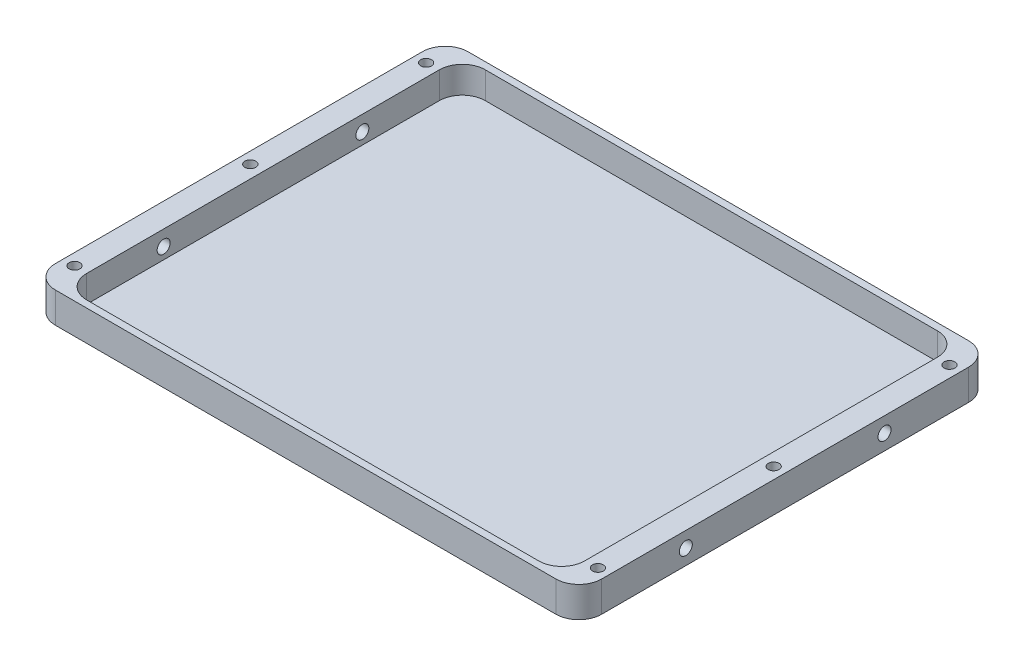
ISO-10303-21;
HEADER;
FILE_DESCRIPTION(('STEP AP214'),'2;1');
FILE_NAME('part.step','',(''),(''),'','','');
FILE_SCHEMA(('AUTOMOTIVE_DESIGN { 1 0 10303 214 1 1 1 1 }'));
ENDSEC;
DATA;
#1=APPLICATION_CONTEXT('core data for automotive mechanical design processes');
#2=APPLICATION_PROTOCOL_DEFINITION('international standard','automotive_design',2000,#1);
#3=PRODUCT_CONTEXT('',#1,'mechanical');
#4=PRODUCT('Part','Part','',(#3));
#5=PRODUCT_RELATED_PRODUCT_CATEGORY('part','',(#4));
#6=PRODUCT_DEFINITION_FORMATION('','',#4);
#7=PRODUCT_DEFINITION_CONTEXT('part definition',#1,'design');
#8=PRODUCT_DEFINITION('design','',#6,#7);
#9=PRODUCT_DEFINITION_SHAPE('','',#8);
#10=(LENGTH_UNIT() NAMED_UNIT(*) SI_UNIT(.MILLI.,.METRE.));
#11=(NAMED_UNIT(*) PLANE_ANGLE_UNIT() SI_UNIT($,.RADIAN.));
#12=(NAMED_UNIT(*) SI_UNIT($,.STERADIAN.) SOLID_ANGLE_UNIT());
#13=UNCERTAINTY_MEASURE_WITH_UNIT(LENGTH_MEASURE(1.E-05),#10,'distance_accuracy_value','');
#14=(GEOMETRIC_REPRESENTATION_CONTEXT(3) GLOBAL_UNCERTAINTY_ASSIGNED_CONTEXT((#13)) GLOBAL_UNIT_ASSIGNED_CONTEXT((#10,
#11,#12)) REPRESENTATION_CONTEXT('',''));
#15=CARTESIAN_POINT('',(0.,0.,0.));
#16=DIRECTION('',(0.,0.,1.));
#17=DIRECTION('',(1.,0.,0.));
#18=AXIS2_PLACEMENT_3D('',#15,#16,#17);
#19=CARTESIAN_POINT('',(0.,12.7,0.));
#20=DIRECTION('',(1.,0.,0.));
#21=DIRECTION('',(0.,0.,-1.));
#22=AXIS2_PLACEMENT_3D('',#19,#20,#21);
#23=PLANE('',#22);
#24=CARTESIAN_POINT('',(0.,6.35,-127.));
#25=DIRECTION('',(-1.,0.,0.));
#26=DIRECTION('',(0.,0.,1.));
#27=AXIS2_PLACEMENT_3D('',#24,#25,#26);
#28=CIRCLE('',#27,2.70509999999999);
#29=CARTESIAN_POINT('',(0.,6.35,-124.2949));
#30=VERTEX_POINT('',#29);
#31=EDGE_CURVE('E501',#30,#30,#28,.T.);
#32=ORIENTED_EDGE('',*,*,#31,.F.);
#33=EDGE_LOOP('',(#32));
#34=FACE_BOUND('',#33,.T.);
#35=CARTESIAN_POINT('',(0.,6.35,-44.45));
#36=DIRECTION('',(-1.,0.,0.));
#37=DIRECTION('',(0.,0.,1.));
#38=AXIS2_PLACEMENT_3D('',#35,#36,#37);
#39=CIRCLE('',#38,2.70509999999999);
#40=CARTESIAN_POINT('',(0.,6.35,-41.7449));
#41=VERTEX_POINT('',#40);
#42=EDGE_CURVE('E506',#41,#41,#39,.T.);
#43=ORIENTED_EDGE('',*,*,#42,.F.);
#44=EDGE_LOOP('',(#43));
#45=FACE_BOUND('',#44,.T.);
#46=DIRECTION('',(0.,0.,1.));
#47=VECTOR('',#46,1.);
#48=CARTESIAN_POINT('',(0.,12.7,0.));
#49=LINE('',#48,#47);
#50=CARTESIAN_POINT('',(0.,12.7,-161.925));
#51=VERTEX_POINT('',#50);
#52=CARTESIAN_POINT('',(0.,12.7,-9.525));
#53=VERTEX_POINT('',#52);
#54=EDGE_CURVE('E226',#51,#53,#49,.T.);
#55=ORIENTED_EDGE('',*,*,#54,.F.);
#56=DIRECTION('',(0.,-1.,0.));
#57=VECTOR('',#56,1.);
#58=CARTESIAN_POINT('',(0.,12.7,-161.925));
#59=LINE('',#58,#57);
#60=CARTESIAN_POINT('',(0.,0.,-161.925));
#61=VERTEX_POINT('',#60);
#62=EDGE_CURVE('E248',#51,#61,#59,.T.);
#63=ORIENTED_EDGE('',*,*,#62,.T.);
#64=DIRECTION('',(0.,0.,1.));
#65=VECTOR('',#64,1.);
#66=CARTESIAN_POINT('',(0.,0.,0.));
#67=LINE('',#66,#65);
#68=CARTESIAN_POINT('',(0.,0.,-9.525));
#69=VERTEX_POINT('',#68);
#70=EDGE_CURVE('E214',#61,#69,#67,.T.);
#71=ORIENTED_EDGE('',*,*,#70,.T.);
#72=DIRECTION('',(0.,-1.,0.));
#73=VECTOR('',#72,1.);
#74=CARTESIAN_POINT('',(0.,12.7,-9.525));
#75=LINE('',#74,#73);
#76=EDGE_CURVE('E237',#69,#53,#75,.F.);
#77=ORIENTED_EDGE('',*,*,#76,.T.);
#78=EDGE_LOOP('',(#55,#63,#71,#77));
#79=FACE_BOUND('',#78,.T.);
#80=ADVANCED_FACE('F34',(#34,#45,#79),#23,.F.);
#81=CARTESIAN_POINT('',(0.,12.7,0.));
#82=DIRECTION('',(0.,0.,-1.));
#83=DIRECTION('',(-1.,0.,0.));
#84=AXIS2_PLACEMENT_3D('',#81,#82,#83);
#85=PLANE('',#84);
#86=DIRECTION('',(1.,0.,0.));
#87=VECTOR('',#86,1.);
#88=CARTESIAN_POINT('',(0.,12.7,0.));
#89=LINE('',#88,#87);
#90=CARTESIAN_POINT('',(9.525,12.7,0.));
#91=VERTEX_POINT('',#90);
#92=CARTESIAN_POINT('',(217.424,12.7,0.));
#93=VERTEX_POINT('',#92);
#94=EDGE_CURVE('E229',#91,#93,#89,.T.);
#95=ORIENTED_EDGE('',*,*,#94,.F.);
#96=DIRECTION('',(0.,-1.,0.));
#97=VECTOR('',#96,1.);
#98=CARTESIAN_POINT('',(9.525,12.7,0.));
#99=LINE('',#98,#97);
#100=CARTESIAN_POINT('',(9.525,0.,0.));
#101=VERTEX_POINT('',#100);
#102=EDGE_CURVE('E273',#91,#101,#99,.T.);
#103=ORIENTED_EDGE('',*,*,#102,.T.);
#104=DIRECTION('',(1.,0.,0.));
#105=VECTOR('',#104,1.);
#106=CARTESIAN_POINT('',(0.,0.,0.));
#107=LINE('',#106,#105);
#108=CARTESIAN_POINT('',(217.424,0.,0.));
#109=VERTEX_POINT('',#108);
#110=EDGE_CURVE('E240',#101,#109,#107,.T.);
#111=ORIENTED_EDGE('',*,*,#110,.T.);
#112=DIRECTION('',(0.,-1.,0.));
#113=VECTOR('',#112,1.);
#114=CARTESIAN_POINT('',(217.424,12.7,0.));
#115=LINE('',#114,#113);
#116=EDGE_CURVE('E271',#109,#93,#115,.F.);
#117=ORIENTED_EDGE('',*,*,#116,.T.);
#118=EDGE_LOOP('',(#95,#103,#111,#117));
#119=FACE_BOUND('',#118,.T.);
#120=ADVANCED_FACE('F279',(#119),#85,.F.);
#121=CARTESIAN_POINT('',(226.949,12.7,0.));
#122=DIRECTION('',(-1.,0.,0.));
#123=DIRECTION('',(0.,0.,1.));
#124=AXIS2_PLACEMENT_3D('',#121,#122,#123);
#125=PLANE('',#124);
#126=CARTESIAN_POINT('',(226.949,6.35,-127.));
#127=DIRECTION('',(1.,0.,0.));
#128=DIRECTION('',(0.,0.,-1.));
#129=AXIS2_PLACEMENT_3D('',#126,#127,#128);
#130=CIRCLE('',#129,2.70509999999999);
#131=CARTESIAN_POINT('',(226.949,6.35,-129.7051));
#132=VERTEX_POINT('',#131);
#133=EDGE_CURVE('E462',#132,#132,#130,.T.);
#134=ORIENTED_EDGE('',*,*,#133,.F.);
#135=EDGE_LOOP('',(#134));
#136=FACE_BOUND('',#135,.T.);
#137=CARTESIAN_POINT('',(226.949,6.35,-44.45));
#138=DIRECTION('',(1.,0.,0.));
#139=DIRECTION('',(0.,0.,-1.));
#140=AXIS2_PLACEMENT_3D('',#137,#138,#139);
#141=CIRCLE('',#140,2.70509999999999);
#142=CARTESIAN_POINT('',(226.949,6.35,-47.1551));
#143=VERTEX_POINT('',#142);
#144=EDGE_CURVE('E468',#143,#143,#141,.T.);
#145=ORIENTED_EDGE('',*,*,#144,.F.);
#146=EDGE_LOOP('',(#145));
#147=FACE_BOUND('',#146,.T.);
#148=DIRECTION('',(0.,0.,-1.));
#149=VECTOR('',#148,1.);
#150=CARTESIAN_POINT('',(226.949,12.7,0.));
#151=LINE('',#150,#149);
#152=CARTESIAN_POINT('',(226.949,12.7,-9.525));
#153=VERTEX_POINT('',#152);
#154=CARTESIAN_POINT('',(226.949,12.7,-161.925));
#155=VERTEX_POINT('',#154);
#156=EDGE_CURVE('E232',#153,#155,#151,.T.);
#157=ORIENTED_EDGE('',*,*,#156,.F.);
#158=DIRECTION('',(0.,-1.,0.));
#159=VECTOR('',#158,1.);
#160=CARTESIAN_POINT('',(226.949,12.7,-9.525));
#161=LINE('',#160,#159);
#162=CARTESIAN_POINT('',(226.949,0.,-9.525));
#163=VERTEX_POINT('',#162);
#164=EDGE_CURVE('E11',#153,#163,#161,.T.);
#165=ORIENTED_EDGE('',*,*,#164,.T.);
#166=DIRECTION('',(0.,0.,-1.));
#167=VECTOR('',#166,1.);
#168=CARTESIAN_POINT('',(226.949,0.,0.));
#169=LINE('',#168,#167);
#170=CARTESIAN_POINT('',(226.949,0.,-161.925));
#171=VERTEX_POINT('',#170);
#172=EDGE_CURVE('E243',#163,#171,#169,.T.);
#173=ORIENTED_EDGE('',*,*,#172,.T.);
#174=DIRECTION('',(0.,-1.,0.));
#175=VECTOR('',#174,1.);
#176=CARTESIAN_POINT('',(226.949,12.7,-161.925));
#177=LINE('',#176,#175);
#178=EDGE_CURVE('E42',#171,#155,#177,.F.);
#179=ORIENTED_EDGE('',*,*,#178,.T.);
#180=EDGE_LOOP('',(#157,#165,#173,#179));
#181=FACE_BOUND('',#180,.T.);
#182=ADVANCED_FACE('F290',(#136,#147,#181),#125,.F.);
#183=CARTESIAN_POINT('',(0.,12.7,-171.45));
#184=DIRECTION('',(0.,0.,1.));
#185=DIRECTION('',(1.,0.,0.));
#186=AXIS2_PLACEMENT_3D('',#183,#184,#185);
#187=PLANE('',#186);
#188=DIRECTION('',(-1.,0.,0.));
#189=VECTOR('',#188,1.);
#190=CARTESIAN_POINT('',(0.,0.,-171.45));
#191=LINE('',#190,#189);
#192=CARTESIAN_POINT('',(217.424,0.,-171.45));
#193=VERTEX_POINT('',#192);
#194=CARTESIAN_POINT('',(9.525,0.,-171.45));
#195=VERTEX_POINT('',#194);
#196=EDGE_CURVE('E230',#193,#195,#191,.T.);
#197=ORIENTED_EDGE('',*,*,#196,.T.);
#198=DIRECTION('',(0.,-1.,0.));
#199=VECTOR('',#198,1.);
#200=CARTESIAN_POINT('',(9.525,12.7,-171.45));
#201=LINE('',#200,#199);
#202=CARTESIAN_POINT('',(9.525,12.7,-171.45));
#203=VERTEX_POINT('',#202);
#204=EDGE_CURVE('E262',#195,#203,#201,.F.);
#205=ORIENTED_EDGE('',*,*,#204,.T.);
#206=DIRECTION('',(-1.,0.,0.));
#207=VECTOR('',#206,1.);
#208=CARTESIAN_POINT('',(0.,12.7,-171.45));
#209=LINE('',#208,#207);
#210=CARTESIAN_POINT('',(217.424,12.7,-171.45));
#211=VERTEX_POINT('',#210);
#212=EDGE_CURVE('E234',#211,#203,#209,.T.);
#213=ORIENTED_EDGE('',*,*,#212,.F.);
#214=DIRECTION('',(0.,-1.,0.));
#215=VECTOR('',#214,1.);
#216=CARTESIAN_POINT('',(217.424,12.7,-171.45));
#217=LINE('',#216,#215);
#218=EDGE_CURVE('E259',#211,#193,#217,.T.);
#219=ORIENTED_EDGE('',*,*,#218,.T.);
#220=EDGE_LOOP('',(#197,#205,#213,#219));
#221=FACE_BOUND('',#220,.T.);
#222=ADVANCED_FACE('F298',(#221),#187,.F.);
#223=CARTESIAN_POINT('',(0.,12.7,-171.45));
#224=DIRECTION('',(0.,-1.,0.));
#225=DIRECTION('',(0.,0.,-1.));
#226=AXIS2_PLACEMENT_3D('',#223,#224,#225);
#227=PLANE('',#226);
#228=CARTESIAN_POINT('',(222.1865,12.7,-12.7));
#229=DIRECTION('',(0.,-1.,0.));
#230=DIRECTION('',(0.,0.,-1.));
#231=AXIS2_PLACEMENT_3D('',#228,#229,#230);
#232=CIRCLE('',#231,2.2479);
#233=CARTESIAN_POINT('',(222.1865,12.7,-14.9479));
#234=VERTEX_POINT('',#233);
#235=EDGE_CURVE('E439',#234,#234,#232,.T.);
#236=ORIENTED_EDGE('',*,*,#235,.T.);
#237=EDGE_LOOP('',(#236));
#238=FACE_BOUND('',#237,.T.);
#239=CARTESIAN_POINT('',(222.1865,12.7,-85.725));
#240=DIRECTION('',(0.,-1.,0.));
#241=DIRECTION('',(0.,0.,-1.));
#242=AXIS2_PLACEMENT_3D('',#239,#240,#241);
#243=CIRCLE('',#242,2.2479);
#244=CARTESIAN_POINT('',(222.1865,12.7,-87.9729));
#245=VERTEX_POINT('',#244);
#246=EDGE_CURVE('E450',#245,#245,#243,.T.);
#247=ORIENTED_EDGE('',*,*,#246,.T.);
#248=EDGE_LOOP('',(#247));
#249=FACE_BOUND('',#248,.T.);
#250=CARTESIAN_POINT('',(222.1865,12.7,-158.75));
#251=DIRECTION('',(0.,-1.,0.));
#252=DIRECTION('',(0.,0.,-1.));
#253=AXIS2_PLACEMENT_3D('',#250,#251,#252);
#254=CIRCLE('',#253,2.2479);
#255=CARTESIAN_POINT('',(222.1865,12.7,-160.9979));
#256=VERTEX_POINT('',#255);
#257=EDGE_CURVE('E459',#256,#256,#254,.T.);
#258=ORIENTED_EDGE('',*,*,#257,.T.);
#259=EDGE_LOOP('',(#258));
#260=FACE_BOUND('',#259,.T.);
#261=CARTESIAN_POINT('',(4.7625,12.7,-12.7));
#262=DIRECTION('',(0.,-1.,0.));
#263=DIRECTION('',(0.,0.,-1.));
#264=AXIS2_PLACEMENT_3D('',#261,#262,#263);
#265=CIRCLE('',#264,2.2479);
#266=CARTESIAN_POINT('',(4.7625,12.7,-14.9479));
#267=VERTEX_POINT('',#266);
#268=EDGE_CURVE('E480',#267,#267,#265,.T.);
#269=ORIENTED_EDGE('',*,*,#268,.T.);
#270=EDGE_LOOP('',(#269));
#271=FACE_BOUND('',#270,.T.);
#272=CARTESIAN_POINT('',(4.76250000000002,12.7,-85.725));
#273=DIRECTION('',(0.,-1.,0.));
#274=DIRECTION('',(0.,0.,-1.));
#275=AXIS2_PLACEMENT_3D('',#272,#273,#274);
#276=CIRCLE('',#275,2.2479);
#277=CARTESIAN_POINT('',(4.76250000000002,12.7,-87.9729));
#278=VERTEX_POINT('',#277);
#279=EDGE_CURVE('E489',#278,#278,#276,.T.);
#280=ORIENTED_EDGE('',*,*,#279,.T.);
#281=EDGE_LOOP('',(#280));
#282=FACE_BOUND('',#281,.T.);
#283=CARTESIAN_POINT('',(4.76250000000003,12.7,-158.75));
#284=DIRECTION('',(0.,-1.,0.));
#285=DIRECTION('',(0.,0.,-1.));
#286=AXIS2_PLACEMENT_3D('',#283,#284,#285);
#287=CIRCLE('',#286,2.2479);
#288=CARTESIAN_POINT('',(4.76250000000003,12.7,-160.9979));
#289=VERTEX_POINT('',#288);
#290=EDGE_CURVE('E498',#289,#289,#287,.T.);
#291=ORIENTED_EDGE('',*,*,#290,.T.);
#292=EDGE_LOOP('',(#291));
#293=FACE_BOUND('',#292,.T.);
#294=DIRECTION('',(-1.,0.,0.));
#295=VECTOR('',#294,1.);
#296=CARTESIAN_POINT('',(19.558,12.7,-168.529));
#297=LINE('',#296,#295);
#298=CARTESIAN_POINT('',(207.391,12.7,-168.529));
#299=VERTEX_POINT('',#298);
#300=CARTESIAN_POINT('',(19.558,12.7,-168.529));
#301=VERTEX_POINT('',#300);
#302=EDGE_CURVE('E196',#299,#301,#297,.T.);
#303=ORIENTED_EDGE('',*,*,#302,.F.);
#304=CARTESIAN_POINT('',(207.391,12.7,-159.004));
#305=DIRECTION('',(0.,1.,0.));
#306=DIRECTION('',(0.,0.,-1.));
#307=AXIS2_PLACEMENT_3D('',#304,#305,#306);
#308=CIRCLE('',#307,9.52500000000001);
#309=CARTESIAN_POINT('',(216.916,12.7,-159.004));
#310=VERTEX_POINT('',#309);
#311=EDGE_CURVE('E155',#310,#299,#308,.T.);
#312=ORIENTED_EDGE('',*,*,#311,.F.);
#313=DIRECTION('',(0.,0.,-1.));
#314=VECTOR('',#313,1.);
#315=CARTESIAN_POINT('',(216.916,12.7,-12.446));
#316=LINE('',#315,#314);
#317=CARTESIAN_POINT('',(216.916,12.7,-12.446));
#318=VERTEX_POINT('',#317);
#319=EDGE_CURVE('E173',#318,#310,#316,.T.);
#320=ORIENTED_EDGE('',*,*,#319,.F.);
#321=CARTESIAN_POINT('',(207.391,12.7,-12.446));
#322=DIRECTION('',(0.,1.,0.));
#323=DIRECTION('',(0.,0.,1.));
#324=AXIS2_PLACEMENT_3D('',#321,#322,#323);
#325=CIRCLE('',#324,9.525);
#326=CARTESIAN_POINT('',(207.391,12.7,-2.92100000000001));
#327=VERTEX_POINT('',#326);
#328=EDGE_CURVE('E176',#327,#318,#325,.T.);
#329=ORIENTED_EDGE('',*,*,#328,.F.);
#330=DIRECTION('',(1.,0.,0.));
#331=VECTOR('',#330,1.);
#332=CARTESIAN_POINT('',(19.558,12.7,-2.92100000000001));
#333=LINE('',#332,#331);
#334=CARTESIAN_POINT('',(19.558,12.7,-2.92100000000001));
#335=VERTEX_POINT('',#334);
#336=EDGE_CURVE('E207',#335,#327,#333,.T.);
#337=ORIENTED_EDGE('',*,*,#336,.F.);
#338=CARTESIAN_POINT('',(19.558,12.7,-12.446));
#339=DIRECTION('',(0.,1.,0.));
#340=DIRECTION('',(0.,0.,-1.));
#341=AXIS2_PLACEMENT_3D('',#338,#339,#340);
#342=CIRCLE('',#341,9.525);
#343=CARTESIAN_POINT('',(10.033,12.7,-12.446));
#344=VERTEX_POINT('',#343);
#345=EDGE_CURVE('E204',#344,#335,#342,.T.);
#346=ORIENTED_EDGE('',*,*,#345,.F.);
#347=DIRECTION('',(0.,0.,1.));
#348=VECTOR('',#347,1.);
#349=CARTESIAN_POINT('',(10.033,12.7,-12.446));
#350=LINE('',#349,#348);
#351=CARTESIAN_POINT('',(10.033,12.7,-159.004));
#352=VERTEX_POINT('',#351);
#353=EDGE_CURVE('E201',#352,#344,#350,.T.);
#354=ORIENTED_EDGE('',*,*,#353,.F.);
#355=CARTESIAN_POINT('',(19.558,12.7,-159.004));
#356=DIRECTION('',(0.,1.,0.));
#357=DIRECTION('',(0.,0.,-1.));
#358=AXIS2_PLACEMENT_3D('',#355,#356,#357);
#359=CIRCLE('',#358,9.525);
#360=EDGE_CURVE('E198',#301,#352,#359,.T.);
#361=ORIENTED_EDGE('',*,*,#360,.F.);
#362=EDGE_LOOP('',(#303,#312,#320,#329,#337,#346,#354,#361));
#363=FACE_BOUND('',#362,.T.);
#364=ORIENTED_EDGE('',*,*,#212,.T.);
#365=CARTESIAN_POINT('',(9.525,12.7,-161.925));
#366=DIRECTION('',(0.,-1.,0.));
#367=DIRECTION('',(0.,0.,-1.));
#368=AXIS2_PLACEMENT_3D('',#365,#366,#367);
#369=CIRCLE('',#368,9.525);
#370=EDGE_CURVE('E269',#203,#51,#369,.F.);
#371=ORIENTED_EDGE('',*,*,#370,.T.);
#372=ORIENTED_EDGE('',*,*,#54,.T.);
#373=CARTESIAN_POINT('',(9.525,12.7,-9.525));
#374=DIRECTION('',(0.,-1.,0.));
#375=DIRECTION('',(0.,0.,-1.));
#376=AXIS2_PLACEMENT_3D('',#373,#374,#375);
#377=CIRCLE('',#376,9.525);
#378=EDGE_CURVE('E267',#53,#91,#377,.F.);
#379=ORIENTED_EDGE('',*,*,#378,.T.);
#380=ORIENTED_EDGE('',*,*,#94,.T.);
#381=CARTESIAN_POINT('',(217.424,12.7,-9.525));
#382=DIRECTION('',(0.,-1.,0.));
#383=DIRECTION('',(0.,0.,-1.));
#384=AXIS2_PLACEMENT_3D('',#381,#382,#383);
#385=CIRCLE('',#384,9.525);
#386=EDGE_CURVE('E55',#93,#153,#385,.F.);
#387=ORIENTED_EDGE('',*,*,#386,.T.);
#388=ORIENTED_EDGE('',*,*,#156,.T.);
#389=CARTESIAN_POINT('',(217.424,12.7,-161.925));
#390=DIRECTION('',(0.,-1.,0.));
#391=DIRECTION('',(0.,0.,-1.));
#392=AXIS2_PLACEMENT_3D('',#389,#390,#391);
#393=CIRCLE('',#392,9.525);
#394=EDGE_CURVE('E264',#155,#211,#393,.F.);
#395=ORIENTED_EDGE('',*,*,#394,.T.);
#396=EDGE_LOOP('',(#364,#371,#372,#379,#380,#387,#388,#395));
#397=FACE_BOUND('',#396,.T.);
#398=ADVANCED_FACE('F292',(#238,#249,#260,#271,#282,#293,#363,#397),#227,.F.);
#399=CARTESIAN_POINT('',(0.,0.,-171.45));
#400=DIRECTION('',(0.,-1.,0.));
#401=DIRECTION('',(0.,0.,-1.));
#402=AXIS2_PLACEMENT_3D('',#399,#400,#401);
#403=PLANE('',#402);
#404=CARTESIAN_POINT('',(222.1865,0.,-12.7));
#405=DIRECTION('',(0.,-1.,0.));
#406=DIRECTION('',(0.,0.,-1.));
#407=AXIS2_PLACEMENT_3D('',#404,#405,#406);
#408=CIRCLE('',#407,4.55929999999999);
#409=CARTESIAN_POINT('',(222.1865,0.,-17.2593));
#410=VERTEX_POINT('',#409);
#411=EDGE_CURVE('E437',#410,#410,#408,.T.);
#412=ORIENTED_EDGE('',*,*,#411,.F.);
#413=EDGE_LOOP('',(#412));
#414=FACE_BOUND('',#413,.T.);
#415=CARTESIAN_POINT('',(222.1865,0.,-85.725));
#416=DIRECTION('',(0.,-1.,0.));
#417=DIRECTION('',(0.,0.,-1.));
#418=AXIS2_PLACEMENT_3D('',#415,#416,#417);
#419=CIRCLE('',#418,4.55929999999999);
#420=CARTESIAN_POINT('',(222.1865,0.,-90.2843));
#421=VERTEX_POINT('',#420);
#422=EDGE_CURVE('E444',#421,#421,#419,.T.);
#423=ORIENTED_EDGE('',*,*,#422,.F.);
#424=EDGE_LOOP('',(#423));
#425=FACE_BOUND('',#424,.T.);
#426=CARTESIAN_POINT('',(222.1865,0.,-158.75));
#427=DIRECTION('',(0.,-1.,0.));
#428=DIRECTION('',(0.,0.,-1.));
#429=AXIS2_PLACEMENT_3D('',#426,#427,#428);
#430=CIRCLE('',#429,4.55929999999999);
#431=CARTESIAN_POINT('',(222.1865,0.,-163.3093));
#432=VERTEX_POINT('',#431);
#433=EDGE_CURVE('E453',#432,#432,#430,.T.);
#434=ORIENTED_EDGE('',*,*,#433,.F.);
#435=EDGE_LOOP('',(#434));
#436=FACE_BOUND('',#435,.T.);
#437=CARTESIAN_POINT('',(4.7625,0.,-12.7));
#438=DIRECTION('',(0.,-1.,0.));
#439=DIRECTION('',(0.,0.,-1.));
#440=AXIS2_PLACEMENT_3D('',#437,#438,#439);
#441=CIRCLE('',#440,4.5593);
#442=CARTESIAN_POINT('',(4.7625,0.,-17.2593));
#443=VERTEX_POINT('',#442);
#444=EDGE_CURVE('E474',#443,#443,#441,.T.);
#445=ORIENTED_EDGE('',*,*,#444,.F.);
#446=EDGE_LOOP('',(#445));
#447=FACE_BOUND('',#446,.T.);
#448=CARTESIAN_POINT('',(4.76250000000002,0.,-85.725));
#449=DIRECTION('',(0.,-1.,0.));
#450=DIRECTION('',(0.,0.,-1.));
#451=AXIS2_PLACEMENT_3D('',#448,#449,#450);
#452=CIRCLE('',#451,4.5593);
#453=CARTESIAN_POINT('',(4.76250000000002,0.,-90.2843));
#454=VERTEX_POINT('',#453);
#455=EDGE_CURVE('E483',#454,#454,#452,.T.);
#456=ORIENTED_EDGE('',*,*,#455,.F.);
#457=EDGE_LOOP('',(#456));
#458=FACE_BOUND('',#457,.T.);
#459=CARTESIAN_POINT('',(4.76250000000003,0.,-158.75));
#460=DIRECTION('',(0.,-1.,0.));
#461=DIRECTION('',(0.,0.,-1.));
#462=AXIS2_PLACEMENT_3D('',#459,#460,#461);
#463=CIRCLE('',#462,4.5593);
#464=CARTESIAN_POINT('',(4.76250000000003,0.,-163.3093));
#465=VERTEX_POINT('',#464);
#466=EDGE_CURVE('E492',#465,#465,#463,.T.);
#467=ORIENTED_EDGE('',*,*,#466,.F.);
#468=EDGE_LOOP('',(#467));
#469=FACE_BOUND('',#468,.T.);
#470=ORIENTED_EDGE('',*,*,#70,.F.);
#471=CARTESIAN_POINT('',(9.525,0.,-161.925));
#472=DIRECTION('',(0.,-1.,0.));
#473=DIRECTION('',(0.,0.,-1.));
#474=AXIS2_PLACEMENT_3D('',#471,#472,#473);
#475=CIRCLE('',#474,9.525);
#476=EDGE_CURVE('E257',#61,#195,#475,.T.);
#477=ORIENTED_EDGE('',*,*,#476,.T.);
#478=ORIENTED_EDGE('',*,*,#196,.F.);
#479=CARTESIAN_POINT('',(217.424,0.,-161.925));
#480=DIRECTION('',(0.,-1.,0.));
#481=DIRECTION('',(0.,0.,-1.));
#482=AXIS2_PLACEMENT_3D('',#479,#480,#481);
#483=CIRCLE('',#482,9.525);
#484=EDGE_CURVE('E251',#193,#171,#483,.T.);
#485=ORIENTED_EDGE('',*,*,#484,.T.);
#486=ORIENTED_EDGE('',*,*,#172,.F.);
#487=CARTESIAN_POINT('',(217.424,0.,-9.525));
#488=DIRECTION('',(0.,-1.,0.));
#489=DIRECTION('',(0.,0.,-1.));
#490=AXIS2_PLACEMENT_3D('',#487,#488,#489);
#491=CIRCLE('',#490,9.525);
#492=EDGE_CURVE('E253',#163,#109,#491,.T.);
#493=ORIENTED_EDGE('',*,*,#492,.T.);
#494=ORIENTED_EDGE('',*,*,#110,.F.);
#495=CARTESIAN_POINT('',(9.525,0.,-9.525));
#496=DIRECTION('',(0.,-1.,0.));
#497=DIRECTION('',(0.,0.,-1.));
#498=AXIS2_PLACEMENT_3D('',#495,#496,#497);
#499=CIRCLE('',#498,9.525);
#500=EDGE_CURVE('E255',#101,#69,#499,.T.);
#501=ORIENTED_EDGE('',*,*,#500,.T.);
#502=EDGE_LOOP('',(#470,#477,#478,#485,#486,#493,#494,#501));
#503=FACE_BOUND('',#502,.T.);
#504=ADVANCED_FACE('F285',(#414,#425,#436,#447,#458,#469,#503),#403,.T.);
#505=CARTESIAN_POINT('',(207.391,1.5875,-159.004));
#506=DIRECTION('',(0.,1.,0.));
#507=DIRECTION('',(0.,0.,1.));
#508=AXIS2_PLACEMENT_3D('',#505,#506,#507);
#509=CYLINDRICAL_SURFACE('',#508,9.52500000000001);
#510=ORIENTED_EDGE('',*,*,#311,.T.);
#511=DIRECTION('',(0.,1.,0.));
#512=VECTOR('',#511,1.);
#513=CARTESIAN_POINT('',(207.391,1.5875,-168.529));
#514=LINE('',#513,#512);
#515=CARTESIAN_POINT('',(207.391,1.5875,-168.529));
#516=VERTEX_POINT('',#515);
#517=EDGE_CURVE('E148',#516,#299,#514,.T.);
#518=ORIENTED_EDGE('',*,*,#517,.F.);
#519=CARTESIAN_POINT('',(207.391,1.5875,-159.004));
#520=DIRECTION('',(0.,1.,0.));
#521=DIRECTION('',(0.,0.,-1.));
#522=AXIS2_PLACEMENT_3D('',#519,#520,#521);
#523=CIRCLE('',#522,9.52500000000001);
#524=CARTESIAN_POINT('',(216.916,1.5875,-159.004));
#525=VERTEX_POINT('',#524);
#526=EDGE_CURVE('E152',#525,#516,#523,.T.);
#527=ORIENTED_EDGE('',*,*,#526,.F.);
#528=DIRECTION('',(0.,1.,0.));
#529=VECTOR('',#528,1.);
#530=CARTESIAN_POINT('',(216.916,1.5875,-159.004));
#531=LINE('',#530,#529);
#532=EDGE_CURVE('E212',#525,#310,#531,.T.);
#533=ORIENTED_EDGE('',*,*,#532,.T.);
#534=EDGE_LOOP('',(#510,#518,#527,#533));
#535=FACE_BOUND('',#534,.T.);
#536=ADVANCED_FACE('F150',(#535),#509,.F.);
#537=CARTESIAN_POINT('',(216.916,1.5875,-12.446));
#538=DIRECTION('',(1.,0.,0.));
#539=DIRECTION('',(0.,0.,-1.));
#540=AXIS2_PLACEMENT_3D('',#537,#538,#539);
#541=PLANE('',#540);
#542=CARTESIAN_POINT('',(216.916,6.35,-127.));
#543=DIRECTION('',(1.,0.,0.));
#544=DIRECTION('',(0.,0.,-1.));
#545=AXIS2_PLACEMENT_3D('',#542,#543,#544);
#546=CIRCLE('',#545,2.70509999999999);
#547=CARTESIAN_POINT('',(216.916,6.35,-129.7051));
#548=VERTEX_POINT('',#547);
#549=EDGE_CURVE('E465',#548,#548,#546,.T.);
#550=ORIENTED_EDGE('',*,*,#549,.T.);
#551=EDGE_LOOP('',(#550));
#552=FACE_BOUND('',#551,.T.);
#553=CARTESIAN_POINT('',(216.916,6.35,-44.45));
#554=DIRECTION('',(1.,0.,0.));
#555=DIRECTION('',(0.,0.,-1.));
#556=AXIS2_PLACEMENT_3D('',#553,#554,#555);
#557=CIRCLE('',#556,2.70509999999999);
#558=CARTESIAN_POINT('',(216.916,6.35,-47.1551));
#559=VERTEX_POINT('',#558);
#560=EDGE_CURVE('E471',#559,#559,#557,.T.);
#561=ORIENTED_EDGE('',*,*,#560,.T.);
#562=EDGE_LOOP('',(#561));
#563=FACE_BOUND('',#562,.T.);
#564=ORIENTED_EDGE('',*,*,#319,.T.);
#565=ORIENTED_EDGE('',*,*,#532,.F.);
#566=DIRECTION('',(0.,0.,-1.));
#567=VECTOR('',#566,1.);
#568=CARTESIAN_POINT('',(216.916,1.5875,-12.446));
#569=LINE('',#568,#567);
#570=CARTESIAN_POINT('',(216.916,1.5875,-12.446));
#571=VERTEX_POINT('',#570);
#572=EDGE_CURVE('E160',#571,#525,#569,.T.);
#573=ORIENTED_EDGE('',*,*,#572,.F.);
#574=DIRECTION('',(0.,1.,0.));
#575=VECTOR('',#574,1.);
#576=CARTESIAN_POINT('',(216.916,1.5875,-12.446));
#577=LINE('',#576,#575);
#578=EDGE_CURVE('E215',#571,#318,#577,.T.);
#579=ORIENTED_EDGE('',*,*,#578,.T.);
#580=EDGE_LOOP('',(#564,#565,#573,#579));
#581=FACE_BOUND('',#580,.T.);
#582=ADVANCED_FACE('F339',(#552,#563,#581),#541,.F.);
#583=CARTESIAN_POINT('',(207.391,1.5875,-12.446));
#584=DIRECTION('',(0.,1.,0.));
#585=DIRECTION('',(0.,0.,1.));
#586=AXIS2_PLACEMENT_3D('',#583,#584,#585);
#587=CYLINDRICAL_SURFACE('',#586,9.525);
#588=ORIENTED_EDGE('',*,*,#328,.T.);
#589=ORIENTED_EDGE('',*,*,#578,.F.);
#590=CARTESIAN_POINT('',(207.391,1.5875,-12.446));
#591=DIRECTION('',(0.,1.,0.));
#592=DIRECTION('',(0.,0.,1.));
#593=AXIS2_PLACEMENT_3D('',#590,#591,#592);
#594=CIRCLE('',#593,9.525);
#595=CARTESIAN_POINT('',(207.391,1.5875,-2.92100000000001));
#596=VERTEX_POINT('',#595);
#597=EDGE_CURVE('E192',#596,#571,#594,.T.);
#598=ORIENTED_EDGE('',*,*,#597,.F.);
#599=DIRECTION('',(0.,1.,0.));
#600=VECTOR('',#599,1.);
#601=CARTESIAN_POINT('',(207.391,1.5875,-2.92100000000001));
#602=LINE('',#601,#600);
#603=EDGE_CURVE('E217',#596,#327,#602,.T.);
#604=ORIENTED_EDGE('',*,*,#603,.T.);
#605=EDGE_LOOP('',(#588,#589,#598,#604));
#606=FACE_BOUND('',#605,.T.);
#607=ADVANCED_FACE('F357',(#606),#587,.F.);
#608=CARTESIAN_POINT('',(19.558,1.5875,-2.92100000000001));
#609=DIRECTION('',(0.,0.,1.));
#610=DIRECTION('',(1.,0.,0.));
#611=AXIS2_PLACEMENT_3D('',#608,#609,#610);
#612=PLANE('',#611);
#613=ORIENTED_EDGE('',*,*,#336,.T.);
#614=ORIENTED_EDGE('',*,*,#603,.F.);
#615=DIRECTION('',(1.,0.,0.));
#616=VECTOR('',#615,1.);
#617=CARTESIAN_POINT('',(19.558,1.5875,-2.92100000000001));
#618=LINE('',#617,#616);
#619=CARTESIAN_POINT('',(19.558,1.5875,-2.92100000000001));
#620=VERTEX_POINT('',#619);
#621=EDGE_CURVE('E189',#620,#596,#618,.T.);
#622=ORIENTED_EDGE('',*,*,#621,.F.);
#623=DIRECTION('',(0.,1.,0.));
#624=VECTOR('',#623,1.);
#625=CARTESIAN_POINT('',(19.558,1.5875,-2.92100000000001));
#626=LINE('',#625,#624);
#627=EDGE_CURVE('E219',#620,#335,#626,.T.);
#628=ORIENTED_EDGE('',*,*,#627,.T.);
#629=EDGE_LOOP('',(#613,#614,#622,#628));
#630=FACE_BOUND('',#629,.T.);
#631=ADVANCED_FACE('F353',(#630),#612,.F.);
#632=CARTESIAN_POINT('',(19.558,1.5875,-12.446));
#633=DIRECTION('',(0.,1.,0.));
#634=DIRECTION('',(0.,0.,1.));
#635=AXIS2_PLACEMENT_3D('',#632,#633,#634);
#636=CYLINDRICAL_SURFACE('',#635,9.525);
#637=ORIENTED_EDGE('',*,*,#345,.T.);
#638=ORIENTED_EDGE('',*,*,#627,.F.);
#639=CARTESIAN_POINT('',(19.558,1.5875,-12.446));
#640=DIRECTION('',(0.,1.,0.));
#641=DIRECTION('',(0.,0.,-1.));
#642=AXIS2_PLACEMENT_3D('',#639,#640,#641);
#643=CIRCLE('',#642,9.525);
#644=CARTESIAN_POINT('',(10.033,1.5875,-12.446));
#645=VERTEX_POINT('',#644);
#646=EDGE_CURVE('E186',#645,#620,#643,.T.);
#647=ORIENTED_EDGE('',*,*,#646,.F.);
#648=DIRECTION('',(0.,1.,0.));
#649=VECTOR('',#648,1.);
#650=CARTESIAN_POINT('',(10.033,1.5875,-12.446));
#651=LINE('',#650,#649);
#652=EDGE_CURVE('E221',#645,#344,#651,.T.);
#653=ORIENTED_EDGE('',*,*,#652,.T.);
#654=EDGE_LOOP('',(#637,#638,#647,#653));
#655=FACE_BOUND('',#654,.T.);
#656=ADVANCED_FACE('F349',(#655),#636,.F.);
#657=CARTESIAN_POINT('',(10.033,1.5875,-12.446));
#658=DIRECTION('',(-1.,0.,0.));
#659=DIRECTION('',(0.,0.,1.));
#660=AXIS2_PLACEMENT_3D('',#657,#658,#659);
#661=PLANE('',#660);
#662=CARTESIAN_POINT('',(10.033,6.35,-127.));
#663=DIRECTION('',(-1.,0.,0.));
#664=DIRECTION('',(0.,0.,1.));
#665=AXIS2_PLACEMENT_3D('',#662,#663,#664);
#666=CIRCLE('',#665,2.70509999999998);
#667=CARTESIAN_POINT('',(10.033,6.35,-124.2949));
#668=VERTEX_POINT('',#667);
#669=EDGE_CURVE('E504',#668,#668,#666,.T.);
#670=ORIENTED_EDGE('',*,*,#669,.T.);
#671=EDGE_LOOP('',(#670));
#672=FACE_BOUND('',#671,.T.);
#673=CARTESIAN_POINT('',(10.033,6.35,-44.45));
#674=DIRECTION('',(-1.,0.,0.));
#675=DIRECTION('',(0.,0.,1.));
#676=AXIS2_PLACEMENT_3D('',#673,#674,#675);
#677=CIRCLE('',#676,2.70509999999998);
#678=CARTESIAN_POINT('',(10.033,6.35,-41.7449));
#679=VERTEX_POINT('',#678);
#680=EDGE_CURVE('E179',#679,#679,#677,.T.);
#681=ORIENTED_EDGE('',*,*,#680,.T.);
#682=EDGE_LOOP('',(#681));
#683=FACE_BOUND('',#682,.T.);
#684=ORIENTED_EDGE('',*,*,#353,.T.);
#685=ORIENTED_EDGE('',*,*,#652,.F.);
#686=DIRECTION('',(0.,0.,1.));
#687=VECTOR('',#686,1.);
#688=CARTESIAN_POINT('',(10.033,1.5875,-12.446));
#689=LINE('',#688,#687);
#690=CARTESIAN_POINT('',(10.033,1.5875,-159.004));
#691=VERTEX_POINT('',#690);
#692=EDGE_CURVE('E183',#691,#645,#689,.T.);
#693=ORIENTED_EDGE('',*,*,#692,.F.);
#694=DIRECTION('',(0.,1.,0.));
#695=VECTOR('',#694,1.);
#696=CARTESIAN_POINT('',(10.033,1.5875,-159.004));
#697=LINE('',#696,#695);
#698=EDGE_CURVE('E223',#691,#352,#697,.T.);
#699=ORIENTED_EDGE('',*,*,#698,.T.);
#700=EDGE_LOOP('',(#684,#685,#693,#699));
#701=FACE_BOUND('',#700,.T.);
#702=ADVANCED_FACE('F345',(#672,#683,#701),#661,.F.);
#703=CARTESIAN_POINT('',(19.558,1.5875,-159.004));
#704=DIRECTION('',(0.,1.,0.));
#705=DIRECTION('',(0.,0.,1.));
#706=AXIS2_PLACEMENT_3D('',#703,#704,#705);
#707=CYLINDRICAL_SURFACE('',#706,9.525);
#708=ORIENTED_EDGE('',*,*,#360,.T.);
#709=ORIENTED_EDGE('',*,*,#698,.F.);
#710=CARTESIAN_POINT('',(19.558,1.5875,-159.004));
#711=DIRECTION('',(0.,1.,0.));
#712=DIRECTION('',(0.,0.,-1.));
#713=AXIS2_PLACEMENT_3D('',#710,#711,#712);
#714=CIRCLE('',#713,9.525);
#715=CARTESIAN_POINT('',(19.558,1.5875,-168.529));
#716=VERTEX_POINT('',#715);
#717=EDGE_CURVE('E168',#716,#691,#714,.T.);
#718=ORIENTED_EDGE('',*,*,#717,.F.);
#719=DIRECTION('',(0.,1.,0.));
#720=VECTOR('',#719,1.);
#721=CARTESIAN_POINT('',(19.558,1.5875,-168.529));
#722=LINE('',#721,#720);
#723=EDGE_CURVE('E159',#716,#301,#722,.T.);
#724=ORIENTED_EDGE('',*,*,#723,.T.);
#725=EDGE_LOOP('',(#708,#709,#718,#724));
#726=FACE_BOUND('',#725,.T.);
#727=ADVANCED_FACE('F342',(#726),#707,.F.);
#728=CARTESIAN_POINT('',(19.558,1.5875,-168.529));
#729=DIRECTION('',(0.,0.,-1.));
#730=DIRECTION('',(-1.,0.,0.));
#731=AXIS2_PLACEMENT_3D('',#728,#729,#730);
#732=PLANE('',#731);
#733=ORIENTED_EDGE('',*,*,#302,.T.);
#734=ORIENTED_EDGE('',*,*,#723,.F.);
#735=DIRECTION('',(-1.,0.,0.));
#736=VECTOR('',#735,1.);
#737=CARTESIAN_POINT('',(19.558,1.5875,-168.529));
#738=LINE('',#737,#736);
#739=EDGE_CURVE('E163',#516,#716,#738,.T.);
#740=ORIENTED_EDGE('',*,*,#739,.F.);
#741=ORIENTED_EDGE('',*,*,#517,.T.);
#742=EDGE_LOOP('',(#733,#734,#740,#741));
#743=FACE_BOUND('',#742,.T.);
#744=ADVANCED_FACE('F164',(#743),#732,.F.);
#745=CARTESIAN_POINT('',(207.391,1.5875,-159.004));
#746=DIRECTION('',(0.,-1.,0.));
#747=DIRECTION('',(0.,0.,-1.));
#748=AXIS2_PLACEMENT_3D('',#745,#746,#747);
#749=PLANE('',#748);
#750=ORIENTED_EDGE('',*,*,#526,.T.);
#751=ORIENTED_EDGE('',*,*,#739,.T.);
#752=ORIENTED_EDGE('',*,*,#717,.T.);
#753=ORIENTED_EDGE('',*,*,#692,.T.);
#754=ORIENTED_EDGE('',*,*,#646,.T.);
#755=ORIENTED_EDGE('',*,*,#621,.T.);
#756=ORIENTED_EDGE('',*,*,#597,.T.);
#757=ORIENTED_EDGE('',*,*,#572,.T.);
#758=EDGE_LOOP('',(#750,#751,#752,#753,#754,#755,#756,#757));
#759=FACE_BOUND('',#758,.T.);
#760=ADVANCED_FACE('F170',(#759),#749,.F.);
#761=CARTESIAN_POINT('',(0.,6.35,-44.45));
#762=DIRECTION('',(-1.,0.,0.));
#763=DIRECTION('',(0.,0.,1.));
#764=AXIS2_PLACEMENT_3D('',#761,#762,#763);
#765=CYLINDRICAL_SURFACE('',#764,2.70509999999998);
#766=ORIENTED_EDGE('',*,*,#680,.F.);
#767=EDGE_LOOP('',(#766));
#768=FACE_BOUND('',#767,.T.);
#769=ORIENTED_EDGE('',*,*,#42,.T.);
#770=EDGE_LOOP('',(#769));
#771=FACE_BOUND('',#770,.T.);
#772=ADVANCED_FACE('F367',(#768,#771),#765,.F.);
#773=CARTESIAN_POINT('',(0.,6.35,-127.));
#774=DIRECTION('',(-1.,0.,0.));
#775=DIRECTION('',(0.,0.,1.));
#776=AXIS2_PLACEMENT_3D('',#773,#774,#775);
#777=CYLINDRICAL_SURFACE('',#776,2.70509999999998);
#778=ORIENTED_EDGE('',*,*,#669,.F.);
#779=EDGE_LOOP('',(#778));
#780=FACE_BOUND('',#779,.T.);
#781=ORIENTED_EDGE('',*,*,#31,.T.);
#782=EDGE_LOOP('',(#781));
#783=FACE_BOUND('',#782,.T.);
#784=ADVANCED_FACE('F370',(#780,#783),#777,.F.);
#785=CARTESIAN_POINT('',(4.76250000000003,0.,-158.75));
#786=DIRECTION('',(0.,-1.,0.));
#787=DIRECTION('',(0.,0.,-1.));
#788=AXIS2_PLACEMENT_3D('',#785,#786,#787);
#789=CYLINDRICAL_SURFACE('',#788,2.24789999999999);
#790=ORIENTED_EDGE('',*,*,#290,.F.);
#791=EDGE_LOOP('',(#790));
#792=FACE_BOUND('',#791,.T.);
#793=CARTESIAN_POINT('',(4.76250000000003,2.65896153645065,-158.75));
#794=DIRECTION('',(0.,-1.,0.));
#795=DIRECTION('',(0.,0.,-1.));
#796=AXIS2_PLACEMENT_3D('',#793,#794,#795);
#797=CIRCLE('',#796,2.24789999999999);
#798=CARTESIAN_POINT('',(4.76250000000003,2.65896153645065,-160.9979));
#799=VERTEX_POINT('',#798);
#800=EDGE_CURVE('E495',#799,#799,#797,.T.);
#801=ORIENTED_EDGE('',*,*,#800,.T.);
#802=EDGE_LOOP('',(#801));
#803=FACE_BOUND('',#802,.T.);
#804=ADVANCED_FACE('F374',(#792,#803),#789,.F.);
#805=CARTESIAN_POINT('',(4.76250000000003,0.,-158.75));
#806=DIRECTION('',(0.,-1.,0.));
#807=DIRECTION('',(0.,0.,-1.));
#808=AXIS2_PLACEMENT_3D('',#805,#806,#807);
#809=CONICAL_SURFACE('',#808,4.5593,0.715584993317676);
#810=ORIENTED_EDGE('',*,*,#800,.F.);
#811=EDGE_LOOP('',(#810));
#812=FACE_BOUND('',#811,.T.);
#813=ORIENTED_EDGE('',*,*,#466,.T.);
#814=EDGE_LOOP('',(#813));
#815=FACE_BOUND('',#814,.T.);
#816=ADVANCED_FACE('F378',(#812,#815),#809,.F.);
#817=CARTESIAN_POINT('',(4.76250000000002,0.,-85.725));
#818=DIRECTION('',(0.,-1.,0.));
#819=DIRECTION('',(0.,0.,-1.));
#820=AXIS2_PLACEMENT_3D('',#817,#818,#819);
#821=CYLINDRICAL_SURFACE('',#820,2.24789999999999);
#822=ORIENTED_EDGE('',*,*,#279,.F.);
#823=EDGE_LOOP('',(#822));
#824=FACE_BOUND('',#823,.T.);
#825=CARTESIAN_POINT('',(4.76250000000002,2.65896153645065,-85.725));
#826=DIRECTION('',(0.,-1.,0.));
#827=DIRECTION('',(0.,0.,-1.));
#828=AXIS2_PLACEMENT_3D('',#825,#826,#827);
#829=CIRCLE('',#828,2.24789999999999);
#830=CARTESIAN_POINT('',(4.76250000000002,2.65896153645065,-87.9729));
#831=VERTEX_POINT('',#830);
#832=EDGE_CURVE('E486',#831,#831,#829,.T.);
#833=ORIENTED_EDGE('',*,*,#832,.T.);
#834=EDGE_LOOP('',(#833));
#835=FACE_BOUND('',#834,.T.);
#836=ADVANCED_FACE('F382',(#824,#835),#821,.F.);
#837=CARTESIAN_POINT('',(4.76250000000002,0.,-85.725));
#838=DIRECTION('',(0.,-1.,0.));
#839=DIRECTION('',(0.,0.,-1.));
#840=AXIS2_PLACEMENT_3D('',#837,#838,#839);
#841=CONICAL_SURFACE('',#840,4.5593,0.715584993317676);
#842=ORIENTED_EDGE('',*,*,#832,.F.);
#843=EDGE_LOOP('',(#842));
#844=FACE_BOUND('',#843,.T.);
#845=ORIENTED_EDGE('',*,*,#455,.T.);
#846=EDGE_LOOP('',(#845));
#847=FACE_BOUND('',#846,.T.);
#848=ADVANCED_FACE('F386',(#844,#847),#841,.F.);
#849=CARTESIAN_POINT('',(4.7625,0.,-12.7));
#850=DIRECTION('',(0.,-1.,0.));
#851=DIRECTION('',(0.,0.,-1.));
#852=AXIS2_PLACEMENT_3D('',#849,#850,#851);
#853=CYLINDRICAL_SURFACE('',#852,2.24789999999999);
#854=ORIENTED_EDGE('',*,*,#268,.F.);
#855=EDGE_LOOP('',(#854));
#856=FACE_BOUND('',#855,.T.);
#857=CARTESIAN_POINT('',(4.7625,2.65896153645065,-12.7));
#858=DIRECTION('',(0.,-1.,0.));
#859=DIRECTION('',(0.,0.,-1.));
#860=AXIS2_PLACEMENT_3D('',#857,#858,#859);
#861=CIRCLE('',#860,2.24789999999999);
#862=CARTESIAN_POINT('',(4.7625,2.65896153645065,-14.9479));
#863=VERTEX_POINT('',#862);
#864=EDGE_CURVE('E477',#863,#863,#861,.T.);
#865=ORIENTED_EDGE('',*,*,#864,.T.);
#866=EDGE_LOOP('',(#865));
#867=FACE_BOUND('',#866,.T.);
#868=ADVANCED_FACE('F390',(#856,#867),#853,.F.);
#869=CARTESIAN_POINT('',(4.7625,0.,-12.7));
#870=DIRECTION('',(0.,-1.,0.));
#871=DIRECTION('',(0.,0.,-1.));
#872=AXIS2_PLACEMENT_3D('',#869,#870,#871);
#873=CONICAL_SURFACE('',#872,4.5593,0.715584993317676);
#874=ORIENTED_EDGE('',*,*,#864,.F.);
#875=EDGE_LOOP('',(#874));
#876=FACE_BOUND('',#875,.T.);
#877=ORIENTED_EDGE('',*,*,#444,.T.);
#878=EDGE_LOOP('',(#877));
#879=FACE_BOUND('',#878,.T.);
#880=ADVANCED_FACE('F394',(#876,#879),#873,.F.);
#881=CARTESIAN_POINT('',(226.949,6.35,-44.45));
#882=DIRECTION('',(1.,0.,0.));
#883=DIRECTION('',(0.,0.,-1.));
#884=AXIS2_PLACEMENT_3D('',#881,#882,#883);
#885=CYLINDRICAL_SURFACE('',#884,2.70509999999999);
#886=ORIENTED_EDGE('',*,*,#560,.F.);
#887=EDGE_LOOP('',(#886));
#888=FACE_BOUND('',#887,.T.);
#889=ORIENTED_EDGE('',*,*,#144,.T.);
#890=EDGE_LOOP('',(#889));
#891=FACE_BOUND('',#890,.T.);
#892=ADVANCED_FACE('F398',(#888,#891),#885,.F.);
#893=CARTESIAN_POINT('',(226.949,6.35,-127.));
#894=DIRECTION('',(1.,0.,0.));
#895=DIRECTION('',(0.,0.,-1.));
#896=AXIS2_PLACEMENT_3D('',#893,#894,#895);
#897=CYLINDRICAL_SURFACE('',#896,2.70509999999999);
#898=ORIENTED_EDGE('',*,*,#549,.F.);
#899=EDGE_LOOP('',(#898));
#900=FACE_BOUND('',#899,.T.);
#901=ORIENTED_EDGE('',*,*,#133,.T.);
#902=EDGE_LOOP('',(#901));
#903=FACE_BOUND('',#902,.T.);
#904=ADVANCED_FACE('F402',(#900,#903),#897,.F.);
#905=CARTESIAN_POINT('',(222.1865,0.,-158.75));
#906=DIRECTION('',(0.,-1.,0.));
#907=DIRECTION('',(0.,0.,-1.));
#908=AXIS2_PLACEMENT_3D('',#905,#906,#907);
#909=CYLINDRICAL_SURFACE('',#908,2.2479);
#910=ORIENTED_EDGE('',*,*,#257,.F.);
#911=EDGE_LOOP('',(#910));
#912=FACE_BOUND('',#911,.T.);
#913=CARTESIAN_POINT('',(222.1865,2.65896153645065,-158.75));
#914=DIRECTION('',(0.,-1.,0.));
#915=DIRECTION('',(0.,0.,-1.));
#916=AXIS2_PLACEMENT_3D('',#913,#914,#915);
#917=CIRCLE('',#916,2.2479);
#918=CARTESIAN_POINT('',(222.1865,2.65896153645065,-160.9979));
#919=VERTEX_POINT('',#918);
#920=EDGE_CURVE('E456',#919,#919,#917,.T.);
#921=ORIENTED_EDGE('',*,*,#920,.T.);
#922=EDGE_LOOP('',(#921));
#923=FACE_BOUND('',#922,.T.);
#924=ADVANCED_FACE('F406',(#912,#923),#909,.F.);
#925=CARTESIAN_POINT('',(222.1865,0.,-158.75));
#926=DIRECTION('',(0.,-1.,0.));
#927=DIRECTION('',(0.,0.,-1.));
#928=AXIS2_PLACEMENT_3D('',#925,#926,#927);
#929=CONICAL_SURFACE('',#928,4.55929999999999,0.715584993317671);
#930=ORIENTED_EDGE('',*,*,#920,.F.);
#931=EDGE_LOOP('',(#930));
#932=FACE_BOUND('',#931,.T.);
#933=ORIENTED_EDGE('',*,*,#433,.T.);
#934=EDGE_LOOP('',(#933));
#935=FACE_BOUND('',#934,.T.);
#936=ADVANCED_FACE('F410',(#932,#935),#929,.F.);
#937=CARTESIAN_POINT('',(222.1865,0.,-85.725));
#938=DIRECTION('',(0.,-1.,0.));
#939=DIRECTION('',(0.,0.,-1.));
#940=AXIS2_PLACEMENT_3D('',#937,#938,#939);
#941=CYLINDRICAL_SURFACE('',#940,2.2479);
#942=ORIENTED_EDGE('',*,*,#246,.F.);
#943=EDGE_LOOP('',(#942));
#944=FACE_BOUND('',#943,.T.);
#945=CARTESIAN_POINT('',(222.1865,2.65896153645065,-85.725));
#946=DIRECTION('',(0.,-1.,0.));
#947=DIRECTION('',(0.,0.,-1.));
#948=AXIS2_PLACEMENT_3D('',#945,#946,#947);
#949=CIRCLE('',#948,2.2479);
#950=CARTESIAN_POINT('',(222.1865,2.65896153645065,-87.9729));
#951=VERTEX_POINT('',#950);
#952=EDGE_CURVE('E447',#951,#951,#949,.T.);
#953=ORIENTED_EDGE('',*,*,#952,.T.);
#954=EDGE_LOOP('',(#953));
#955=FACE_BOUND('',#954,.T.);
#956=ADVANCED_FACE('F414',(#944,#955),#941,.F.);
#957=CARTESIAN_POINT('',(222.1865,0.,-85.725));
#958=DIRECTION('',(0.,-1.,0.));
#959=DIRECTION('',(0.,0.,-1.));
#960=AXIS2_PLACEMENT_3D('',#957,#958,#959);
#961=CONICAL_SURFACE('',#960,4.55929999999999,0.715584993317671);
#962=ORIENTED_EDGE('',*,*,#952,.F.);
#963=EDGE_LOOP('',(#962));
#964=FACE_BOUND('',#963,.T.);
#965=ORIENTED_EDGE('',*,*,#422,.T.);
#966=EDGE_LOOP('',(#965));
#967=FACE_BOUND('',#966,.T.);
#968=ADVANCED_FACE('F418',(#964,#967),#961,.F.);
#969=CARTESIAN_POINT('',(222.1865,0.,-12.7));
#970=DIRECTION('',(0.,-1.,0.));
#971=DIRECTION('',(0.,0.,-1.));
#972=AXIS2_PLACEMENT_3D('',#969,#970,#971);
#973=CYLINDRICAL_SURFACE('',#972,2.2479);
#974=ORIENTED_EDGE('',*,*,#235,.F.);
#975=EDGE_LOOP('',(#974));
#976=FACE_BOUND('',#975,.T.);
#977=CARTESIAN_POINT('',(222.1865,2.65896153645065,-12.7));
#978=DIRECTION('',(0.,-1.,0.));
#979=DIRECTION('',(0.,0.,-1.));
#980=AXIS2_PLACEMENT_3D('',#977,#978,#979);
#981=CIRCLE('',#980,2.2479);
#982=CARTESIAN_POINT('',(222.1865,2.65896153645065,-14.9479));
#983=VERTEX_POINT('',#982);
#984=EDGE_CURVE('E434',#983,#983,#981,.T.);
#985=ORIENTED_EDGE('',*,*,#984,.T.);
#986=EDGE_LOOP('',(#985));
#987=FACE_BOUND('',#986,.T.);
#988=ADVANCED_FACE('F422',(#976,#987),#973,.F.);
#989=CARTESIAN_POINT('',(222.1865,0.,-12.7));
#990=DIRECTION('',(0.,-1.,0.));
#991=DIRECTION('',(0.,0.,-1.));
#992=AXIS2_PLACEMENT_3D('',#989,#990,#991);
#993=CONICAL_SURFACE('',#992,4.55929999999999,0.715584993317671);
#994=ORIENTED_EDGE('',*,*,#984,.F.);
#995=EDGE_LOOP('',(#994));
#996=FACE_BOUND('',#995,.T.);
#997=ORIENTED_EDGE('',*,*,#411,.T.);
#998=EDGE_LOOP('',(#997));
#999=FACE_BOUND('',#998,.T.);
#1000=ADVANCED_FACE('F314',(#996,#999),#993,.F.);
#1001=CARTESIAN_POINT('',(9.525,12.7,-161.925));
#1002=DIRECTION('',(0.,-1.,0.));
#1003=DIRECTION('',(0.,0.,-1.));
#1004=AXIS2_PLACEMENT_3D('',#1001,#1002,#1003);
#1005=CYLINDRICAL_SURFACE('',#1004,9.525);
#1006=ORIENTED_EDGE('',*,*,#370,.F.);
#1007=ORIENTED_EDGE('',*,*,#204,.F.);
#1008=ORIENTED_EDGE('',*,*,#476,.F.);
#1009=ORIENTED_EDGE('',*,*,#62,.F.);
#1010=EDGE_LOOP('',(#1006,#1007,#1008,#1009));
#1011=FACE_BOUND('',#1010,.T.);
#1012=ADVANCED_FACE('F303',(#1011),#1005,.T.);
#1013=CARTESIAN_POINT('',(9.525,12.7,-9.525));
#1014=DIRECTION('',(0.,-1.,0.));
#1015=DIRECTION('',(0.,0.,-1.));
#1016=AXIS2_PLACEMENT_3D('',#1013,#1014,#1015);
#1017=CYLINDRICAL_SURFACE('',#1016,9.525);
#1018=ORIENTED_EDGE('',*,*,#378,.F.);
#1019=ORIENTED_EDGE('',*,*,#76,.F.);
#1020=ORIENTED_EDGE('',*,*,#500,.F.);
#1021=ORIENTED_EDGE('',*,*,#102,.F.);
#1022=EDGE_LOOP('',(#1018,#1019,#1020,#1021));
#1023=FACE_BOUND('',#1022,.T.);
#1024=ADVANCED_FACE('F307',(#1023),#1017,.T.);
#1025=CARTESIAN_POINT('',(217.424,12.7,-9.525));
#1026=DIRECTION('',(0.,-1.,0.));
#1027=DIRECTION('',(0.,0.,-1.));
#1028=AXIS2_PLACEMENT_3D('',#1025,#1026,#1027);
#1029=CYLINDRICAL_SURFACE('',#1028,9.525);
#1030=ORIENTED_EDGE('',*,*,#386,.F.);
#1031=ORIENTED_EDGE('',*,*,#116,.F.);
#1032=ORIENTED_EDGE('',*,*,#492,.F.);
#1033=ORIENTED_EDGE('',*,*,#164,.F.);
#1034=EDGE_LOOP('',(#1030,#1031,#1032,#1033));
#1035=FACE_BOUND('',#1034,.T.);
#1036=ADVANCED_FACE('F289',(#1035),#1029,.T.);
#1037=CARTESIAN_POINT('',(217.424,12.7,-161.925));
#1038=DIRECTION('',(0.,-1.,0.));
#1039=DIRECTION('',(0.,0.,-1.));
#1040=AXIS2_PLACEMENT_3D('',#1037,#1038,#1039);
#1041=CYLINDRICAL_SURFACE('',#1040,9.525);
#1042=ORIENTED_EDGE('',*,*,#394,.F.);
#1043=ORIENTED_EDGE('',*,*,#178,.F.);
#1044=ORIENTED_EDGE('',*,*,#484,.F.);
#1045=ORIENTED_EDGE('',*,*,#218,.F.);
#1046=EDGE_LOOP('',(#1042,#1043,#1044,#1045));
#1047=FACE_BOUND('',#1046,.T.);
#1048=ADVANCED_FACE('F36',(#1047),#1041,.T.);
#1049=CLOSED_SHELL('',(#80,#120,#182,#222,#398,#504,#536,#582,#607,#631,#656,#702,#727,#744,
#760,#772,#784,#804,#816,#836,#848,#868,#880,#892,#904,#924,#936,#956,#968,#988,#1000,#1012,
#1024,#1036,#1048));
#1050=MANIFOLD_SOLID_BREP('B2',#1049);
#1051=ADVANCED_BREP_SHAPE_REPRESENTATION('',(#18,#1050),#14);
#1052=SHAPE_DEFINITION_REPRESENTATION(#9,#1051);
ENDSEC;
END-ISO-10303-21;
